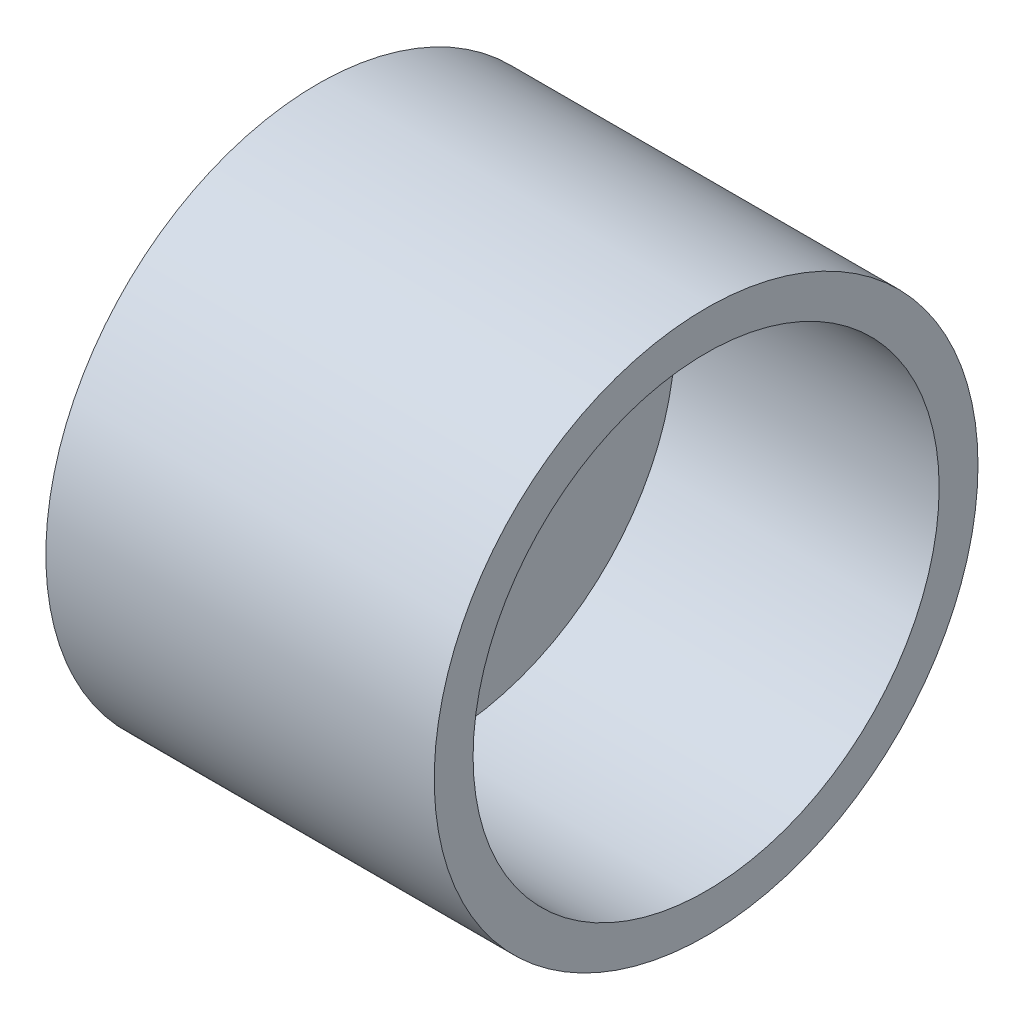
ISO-10303-21;
HEADER;
FILE_DESCRIPTION(('STEP AP214'),'2;1');
FILE_NAME('part.step','',(''),(''),'','','');
FILE_SCHEMA(('AUTOMOTIVE_DESIGN { 1 0 10303 214 1 1 1 1 }'));
ENDSEC;
DATA;
#1=APPLICATION_CONTEXT('core data for automotive mechanical design processes');
#2=APPLICATION_PROTOCOL_DEFINITION('international standard','automotive_design',2000,#1);
#3=PRODUCT_CONTEXT('',#1,'mechanical');
#4=PRODUCT('Part','Part','',(#3));
#5=PRODUCT_RELATED_PRODUCT_CATEGORY('part','',(#4));
#6=PRODUCT_DEFINITION_FORMATION('','',#4);
#7=PRODUCT_DEFINITION_CONTEXT('part definition',#1,'design');
#8=PRODUCT_DEFINITION('design','',#6,#7);
#9=PRODUCT_DEFINITION_SHAPE('','',#8);
#10=(LENGTH_UNIT() NAMED_UNIT(*) SI_UNIT(.MILLI.,.METRE.));
#11=(NAMED_UNIT(*) PLANE_ANGLE_UNIT() SI_UNIT($,.RADIAN.));
#12=(NAMED_UNIT(*) SI_UNIT($,.STERADIAN.) SOLID_ANGLE_UNIT());
#13=UNCERTAINTY_MEASURE_WITH_UNIT(LENGTH_MEASURE(1.E-05),#10,'distance_accuracy_value','');
#14=(GEOMETRIC_REPRESENTATION_CONTEXT(3) GLOBAL_UNCERTAINTY_ASSIGNED_CONTEXT((#13)) GLOBAL_UNIT_ASSIGNED_CONTEXT((#10,
#11,#12)) REPRESENTATION_CONTEXT('',''));
#15=CARTESIAN_POINT('',(0.,0.,0.));
#16=DIRECTION('',(0.,0.,1.));
#17=DIRECTION('',(1.,0.,0.));
#18=AXIS2_PLACEMENT_3D('',#15,#16,#17);
#19=CARTESIAN_POINT('',(25.,0.,0.));
#20=DIRECTION('',(-1.,0.,0.));
#21=DIRECTION('',(0.,0.,1.));
#22=AXIS2_PLACEMENT_3D('',#19,#20,#21);
#23=CYLINDRICAL_SURFACE('',#22,15.);
#24=CARTESIAN_POINT('',(8.,0.,0.));
#25=DIRECTION('',(1.,0.,0.));
#26=DIRECTION('',(0.,0.,-1.));
#27=AXIS2_PLACEMENT_3D('',#24,#25,#26);
#28=CIRCLE('',#27,15.);
#29=CARTESIAN_POINT('',(8.,0.,-15.));
#30=VERTEX_POINT('',#29);
#31=EDGE_CURVE('E10',#30,#30,#28,.T.);
#32=ORIENTED_EDGE('',*,*,#31,.F.);
#33=EDGE_LOOP('',(#32));
#34=FACE_BOUND('',#33,.T.);
#35=CARTESIAN_POINT('',(25.,0.,0.));
#36=DIRECTION('',(1.,0.,0.));
#37=DIRECTION('',(0.,0.,-1.));
#38=AXIS2_PLACEMENT_3D('',#35,#36,#37);
#39=CIRCLE('',#38,15.);
#40=CARTESIAN_POINT('',(25.,0.,-15.));
#41=VERTEX_POINT('',#40);
#42=EDGE_CURVE('E51',#41,#41,#39,.T.);
#43=ORIENTED_EDGE('',*,*,#42,.T.);
#44=EDGE_LOOP('',(#43));
#45=FACE_BOUND('',#44,.T.);
#46=ADVANCED_FACE('F39',(#34,#45),#23,.F.);
#47=CARTESIAN_POINT('',(25.,0.,0.));
#48=DIRECTION('',(-1.,0.,0.));
#49=DIRECTION('',(0.,0.,1.));
#50=AXIS2_PLACEMENT_3D('',#47,#48,#49);
#51=CYLINDRICAL_SURFACE('',#50,17.5);
#52=CARTESIAN_POINT('',(25.,0.,0.));
#53=DIRECTION('',(1.,0.,0.));
#54=DIRECTION('',(0.,0.,-1.));
#55=AXIS2_PLACEMENT_3D('',#52,#53,#54);
#56=CIRCLE('',#55,17.5);
#57=CARTESIAN_POINT('',(25.,0.,-17.5));
#58=VERTEX_POINT('',#57);
#59=EDGE_CURVE('E46',#58,#58,#56,.T.);
#60=ORIENTED_EDGE('',*,*,#59,.F.);
#61=EDGE_LOOP('',(#60));
#62=FACE_BOUND('',#61,.T.);
#63=CARTESIAN_POINT('',(0.,0.,0.));
#64=DIRECTION('',(1.,0.,0.));
#65=DIRECTION('',(0.,0.,-1.));
#66=AXIS2_PLACEMENT_3D('',#63,#64,#65);
#67=CIRCLE('',#66,17.5);
#68=CARTESIAN_POINT('',(0.,0.,-17.5));
#69=VERTEX_POINT('',#68);
#70=EDGE_CURVE('E57',#69,#69,#67,.T.);
#71=ORIENTED_EDGE('',*,*,#70,.T.);
#72=EDGE_LOOP('',(#71));
#73=FACE_BOUND('',#72,.T.);
#74=ADVANCED_FACE('F92',(#62,#73),#51,.T.);
#75=CARTESIAN_POINT('',(25.,0.,0.));
#76=DIRECTION('',(1.,0.,0.));
#77=DIRECTION('',(0.,0.,-1.));
#78=AXIS2_PLACEMENT_3D('',#75,#76,#77);
#79=PLANE('',#78);
#80=ORIENTED_EDGE('',*,*,#42,.F.);
#81=EDGE_LOOP('',(#80));
#82=FACE_BOUND('',#81,.T.);
#83=ORIENTED_EDGE('',*,*,#59,.T.);
#84=EDGE_LOOP('',(#83));
#85=FACE_BOUND('',#84,.T.);
#86=ADVANCED_FACE('F87',(#82,#85),#79,.T.);
#87=CARTESIAN_POINT('',(0.,0.,0.));
#88=DIRECTION('',(1.,0.,0.));
#89=DIRECTION('',(0.,0.,-1.));
#90=AXIS2_PLACEMENT_3D('',#87,#88,#89);
#91=PLANE('',#90);
#92=ORIENTED_EDGE('',*,*,#70,.F.);
#93=EDGE_LOOP('',(#92));
#94=FACE_BOUND('',#93,.T.);
#95=CARTESIAN_POINT('',(0.,0.,0.));
#96=DIRECTION('',(1.,0.,0.));
#97=DIRECTION('',(0.,0.,-1.));
#98=AXIS2_PLACEMENT_3D('',#95,#96,#97);
#99=CIRCLE('',#98,1.5);
#100=CARTESIAN_POINT('',(0.,0.,-1.5));
#101=VERTEX_POINT('',#100);
#102=EDGE_CURVE('E67',#101,#101,#99,.T.);
#103=ORIENTED_EDGE('',*,*,#102,.T.);
#104=EDGE_LOOP('',(#103));
#105=FACE_BOUND('',#104,.T.);
#106=ADVANCED_FACE('F75',(#94,#105),#91,.F.);
#107=CARTESIAN_POINT('',(8.,0.,0.));
#108=DIRECTION('',(-1.,0.,0.));
#109=DIRECTION('',(0.,0.,1.));
#110=AXIS2_PLACEMENT_3D('',#107,#108,#109);
#111=CYLINDRICAL_SURFACE('',#110,1.5);
#112=CARTESIAN_POINT('',(8.,0.,0.));
#113=DIRECTION('',(1.,0.,0.));
#114=DIRECTION('',(0.,0.,-1.));
#115=AXIS2_PLACEMENT_3D('',#112,#113,#114);
#116=CIRCLE('',#115,1.5);
#117=CARTESIAN_POINT('',(8.,0.,-1.5));
#118=VERTEX_POINT('',#117);
#119=EDGE_CURVE('E62',#118,#118,#116,.T.);
#120=ORIENTED_EDGE('',*,*,#119,.T.);
#121=EDGE_LOOP('',(#120));
#122=FACE_BOUND('',#121,.T.);
#123=ORIENTED_EDGE('',*,*,#102,.F.);
#124=EDGE_LOOP('',(#123));
#125=FACE_BOUND('',#124,.T.);
#126=ADVANCED_FACE('F77',(#122,#125),#111,.F.);
#127=CARTESIAN_POINT('',(8.,0.,0.));
#128=DIRECTION('',(1.,0.,0.));
#129=DIRECTION('',(0.,0.,-1.));
#130=AXIS2_PLACEMENT_3D('',#127,#128,#129);
#131=PLANE('',#130);
#132=ORIENTED_EDGE('',*,*,#119,.F.);
#133=EDGE_LOOP('',(#132));
#134=FACE_BOUND('',#133,.T.);
#135=ORIENTED_EDGE('',*,*,#31,.T.);
#136=EDGE_LOOP('',(#135));
#137=FACE_BOUND('',#136,.T.);
#138=ADVANCED_FACE('F79',(#134,#137),#131,.T.);
#139=CLOSED_SHELL('',(#46,#74,#86,#106,#126,#138));
#140=MANIFOLD_SOLID_BREP('B2',#139);
#141=ADVANCED_BREP_SHAPE_REPRESENTATION('',(#18,#140),#14);
#142=SHAPE_DEFINITION_REPRESENTATION(#9,#141);
ENDSEC;
END-ISO-10303-21;
